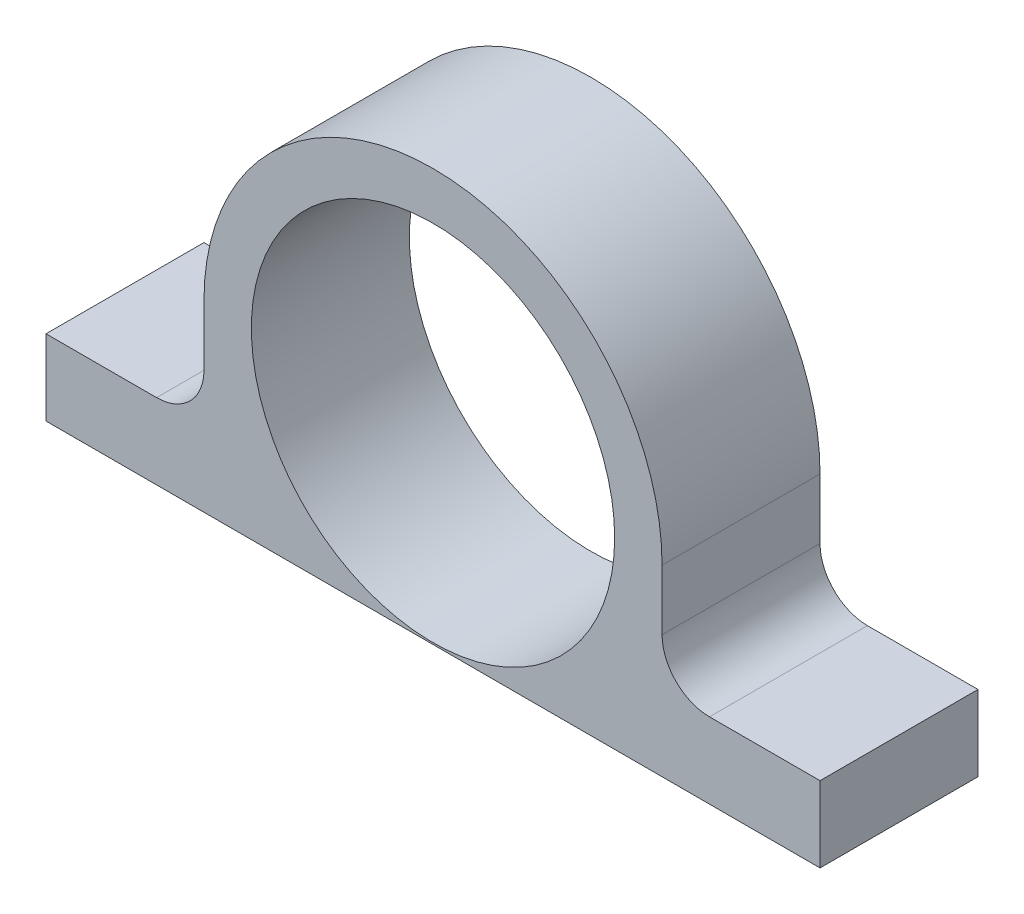
ISO-10303-21;
HEADER;
FILE_DESCRIPTION(('STEP AP214'),'2;1');
FILE_NAME('part.step','',(''),(''),'','','');
FILE_SCHEMA(('AUTOMOTIVE_DESIGN { 1 0 10303 214 1 1 1 1 }'));
ENDSEC;
DATA;
#1=APPLICATION_CONTEXT('core data for automotive mechanical design processes');
#2=APPLICATION_PROTOCOL_DEFINITION('international standard','automotive_design',2000,#1);
#3=PRODUCT_CONTEXT('',#1,'mechanical');
#4=PRODUCT('Part','Part','',(#3));
#5=PRODUCT_RELATED_PRODUCT_CATEGORY('part','',(#4));
#6=PRODUCT_DEFINITION_FORMATION('','',#4);
#7=PRODUCT_DEFINITION_CONTEXT('part definition',#1,'design');
#8=PRODUCT_DEFINITION('design','',#6,#7);
#9=PRODUCT_DEFINITION_SHAPE('','',#8);
#10=(LENGTH_UNIT() NAMED_UNIT(*) SI_UNIT(.MILLI.,.METRE.));
#11=(NAMED_UNIT(*) PLANE_ANGLE_UNIT() SI_UNIT($,.RADIAN.));
#12=(NAMED_UNIT(*) SI_UNIT($,.STERADIAN.) SOLID_ANGLE_UNIT());
#13=UNCERTAINTY_MEASURE_WITH_UNIT(LENGTH_MEASURE(1.E-05),#10,'distance_accuracy_value','');
#14=(GEOMETRIC_REPRESENTATION_CONTEXT(3) GLOBAL_UNCERTAINTY_ASSIGNED_CONTEXT((#13)) GLOBAL_UNIT_ASSIGNED_CONTEXT((#10,
#11,#12)) REPRESENTATION_CONTEXT('',''));
#15=CARTESIAN_POINT('',(0.,0.,0.));
#16=DIRECTION('',(0.,0.,1.));
#17=DIRECTION('',(1.,0.,0.));
#18=AXIS2_PLACEMENT_3D('',#15,#16,#17);
#19=CARTESIAN_POINT('',(0.,78.0732794304208,10.));
#20=DIRECTION('',(0.,1.,0.));
#21=DIRECTION('',(0.,0.,1.));
#22=AXIS2_PLACEMENT_3D('',#19,#20,#21);
#23=PLANE('',#22);
#24=DIRECTION('',(1.,0.,0.));
#25=VECTOR('',#24,1.);
#26=CARTESIAN_POINT('',(0.,78.0732794304208,0.));
#27=LINE('',#26,#25);
#28=CARTESIAN_POINT('',(17.5,78.0732794304208,0.));
#29=VERTEX_POINT('',#28);
#30=CARTESIAN_POINT('',(24.5,78.0732794304208,0.));
#31=VERTEX_POINT('',#30);
#32=EDGE_CURVE('E175',#29,#31,#27,.T.);
#33=ORIENTED_EDGE('',*,*,#32,.F.);
#34=DIRECTION('',(0.,0.,-1.));
#35=VECTOR('',#34,1.);
#36=CARTESIAN_POINT('',(17.5,78.0732794304208,10.));
#37=LINE('',#36,#35);
#38=CARTESIAN_POINT('',(17.5,78.0732794304208,10.));
#39=VERTEX_POINT('',#38);
#40=EDGE_CURVE('E11',#39,#29,#37,.T.);
#41=ORIENTED_EDGE('',*,*,#40,.F.);
#42=DIRECTION('',(1.,0.,0.));
#43=VECTOR('',#42,1.);
#44=CARTESIAN_POINT('',(0.,78.0732794304208,10.));
#45=LINE('',#44,#43);
#46=CARTESIAN_POINT('',(24.5,78.0732794304208,10.));
#47=VERTEX_POINT('',#46);
#48=EDGE_CURVE('E334',#39,#47,#45,.T.);
#49=ORIENTED_EDGE('',*,*,#48,.T.);
#50=DIRECTION('',(0.,0.,-1.));
#51=VECTOR('',#50,1.);
#52=CARTESIAN_POINT('',(24.5,78.0732794304208,10.));
#53=LINE('',#52,#51);
#54=EDGE_CURVE('E59',#47,#31,#53,.T.);
#55=ORIENTED_EDGE('',*,*,#54,.T.);
#56=EDGE_LOOP('',(#33,#41,#49,#55));
#57=FACE_BOUND('',#56,.T.);
#58=ADVANCED_FACE('F41',(#57),#23,.T.);
#59=CARTESIAN_POINT('',(17.5,81.0732794304208,10.));
#60=DIRECTION('',(0.,0.,-1.));
#61=DIRECTION('',(-1.,0.,0.));
#62=AXIS2_PLACEMENT_3D('',#59,#60,#61);
#63=CYLINDRICAL_SURFACE('',#62,3.);
#64=CARTESIAN_POINT('',(17.5,81.0732794304208,0.));
#65=DIRECTION('',(0.,0.,1.));
#66=DIRECTION('',(1.,0.,0.));
#67=AXIS2_PLACEMENT_3D('',#64,#65,#66);
#68=CIRCLE('',#67,3.);
#69=CARTESIAN_POINT('',(14.5,81.0732794304208,0.));
#70=VERTEX_POINT('',#69);
#71=EDGE_CURVE('E166',#29,#70,#68,.F.);
#72=ORIENTED_EDGE('',*,*,#71,.T.);
#73=DIRECTION('',(0.,0.,-1.));
#74=VECTOR('',#73,1.);
#75=CARTESIAN_POINT('',(14.5,81.0732794304208,10.));
#76=LINE('',#75,#74);
#77=CARTESIAN_POINT('',(14.5,81.0732794304208,10.));
#78=VERTEX_POINT('',#77);
#79=EDGE_CURVE('E49',#78,#70,#76,.T.);
#80=ORIENTED_EDGE('',*,*,#79,.F.);
#81=CARTESIAN_POINT('',(17.5,81.0732794304208,10.));
#82=DIRECTION('',(0.,0.,1.));
#83=DIRECTION('',(1.,0.,0.));
#84=AXIS2_PLACEMENT_3D('',#81,#82,#83);
#85=CIRCLE('',#84,3.);
#86=EDGE_CURVE('E332',#39,#78,#85,.F.);
#87=ORIENTED_EDGE('',*,*,#86,.F.);
#88=ORIENTED_EDGE('',*,*,#40,.T.);
#89=EDGE_LOOP('',(#72,#80,#87,#88));
#90=FACE_BOUND('',#89,.T.);
#91=ADVANCED_FACE('F168',(#90),#63,.F.);
#92=CARTESIAN_POINT('',(14.4999999999999,0.,10.));
#93=DIRECTION('',(1.,0.,0.));
#94=DIRECTION('',(0.,1.,0.));
#95=AXIS2_PLACEMENT_3D('',#92,#93,#94);
#96=PLANE('',#95);
#97=DIRECTION('',(0.,-1.,0.));
#98=VECTOR('',#97,1.);
#99=CARTESIAN_POINT('',(14.4999999999999,0.,0.));
#100=LINE('',#99,#98);
#101=CARTESIAN_POINT('',(14.5,84.8872475907308,0.));
#102=VERTEX_POINT('',#101);
#103=EDGE_CURVE('E163',#102,#70,#100,.T.);
#104=ORIENTED_EDGE('',*,*,#103,.F.);
#105=DIRECTION('',(0.,0.,-1.));
#106=VECTOR('',#105,1.);
#107=CARTESIAN_POINT('',(14.5,84.8872475907308,10.));
#108=LINE('',#107,#106);
#109=CARTESIAN_POINT('',(14.5,84.8872475907308,10.));
#110=VERTEX_POINT('',#109);
#111=EDGE_CURVE('E156',#110,#102,#108,.T.);
#112=ORIENTED_EDGE('',*,*,#111,.F.);
#113=DIRECTION('',(0.,-1.,0.));
#114=VECTOR('',#113,1.);
#115=CARTESIAN_POINT('',(14.4999999999999,0.,10.));
#116=LINE('',#115,#114);
#117=EDGE_CURVE('E167',#110,#78,#116,.T.);
#118=ORIENTED_EDGE('',*,*,#117,.T.);
#119=ORIENTED_EDGE('',*,*,#79,.T.);
#120=EDGE_LOOP('',(#104,#112,#118,#119));
#121=FACE_BOUND('',#120,.T.);
#122=ADVANCED_FACE('F165',(#121),#96,.T.);
#123=CARTESIAN_POINT('',(0.,84.8872475907308,10.));
#124=DIRECTION('',(0.,0.,-1.));
#125=DIRECTION('',(-1.,0.,0.));
#126=AXIS2_PLACEMENT_3D('',#123,#124,#125);
#127=CYLINDRICAL_SURFACE('',#126,14.5);
#128=CARTESIAN_POINT('',(0.,84.8872475907308,0.));
#129=DIRECTION('',(0.,0.,1.));
#130=DIRECTION('',(1.,0.,0.));
#131=AXIS2_PLACEMENT_3D('',#128,#129,#130);
#132=CIRCLE('',#131,14.5);
#133=CARTESIAN_POINT('',(-14.5,84.8872475907308,0.));
#134=VERTEX_POINT('',#133);
#135=EDGE_CURVE('E180',#102,#134,#132,.T.);
#136=ORIENTED_EDGE('',*,*,#135,.T.);
#137=DIRECTION('',(0.,0.,-1.));
#138=VECTOR('',#137,1.);
#139=CARTESIAN_POINT('',(-14.5,84.8872475907308,10.));
#140=LINE('',#139,#138);
#141=CARTESIAN_POINT('',(-14.5,84.8872475907308,10.));
#142=VERTEX_POINT('',#141);
#143=EDGE_CURVE('E153',#142,#134,#140,.T.);
#144=ORIENTED_EDGE('',*,*,#143,.F.);
#145=CARTESIAN_POINT('',(0.,84.8872475907308,10.));
#146=DIRECTION('',(0.,0.,1.));
#147=DIRECTION('',(1.,0.,0.));
#148=AXIS2_PLACEMENT_3D('',#145,#146,#147);
#149=CIRCLE('',#148,14.5);
#150=EDGE_CURVE('E328',#110,#142,#149,.T.);
#151=ORIENTED_EDGE('',*,*,#150,.F.);
#152=ORIENTED_EDGE('',*,*,#111,.T.);
#153=EDGE_LOOP('',(#136,#144,#151,#152));
#154=FACE_BOUND('',#153,.T.);
#155=ADVANCED_FACE('F222',(#154),#127,.T.);
#156=CARTESIAN_POINT('',(-14.5,0.,10.));
#157=DIRECTION('',(1.,0.,0.));
#158=DIRECTION('',(0.,1.,0.));
#159=AXIS2_PLACEMENT_3D('',#156,#157,#158);
#160=PLANE('',#159);
#161=DIRECTION('',(0.,-1.,0.));
#162=VECTOR('',#161,1.);
#163=CARTESIAN_POINT('',(-14.5,0.,0.));
#164=LINE('',#163,#162);
#165=CARTESIAN_POINT('',(-14.5,81.0732794304208,0.));
#166=VERTEX_POINT('',#165);
#167=EDGE_CURVE('E178',#134,#166,#164,.T.);
#168=ORIENTED_EDGE('',*,*,#167,.T.);
#169=DIRECTION('',(0.,0.,-1.));
#170=VECTOR('',#169,1.);
#171=CARTESIAN_POINT('',(-14.5,81.0732794304208,10.));
#172=LINE('',#171,#170);
#173=CARTESIAN_POINT('',(-14.5,81.0732794304208,10.));
#174=VERTEX_POINT('',#173);
#175=EDGE_CURVE('E151',#174,#166,#172,.T.);
#176=ORIENTED_EDGE('',*,*,#175,.F.);
#177=DIRECTION('',(0.,-1.,0.));
#178=VECTOR('',#177,1.);
#179=CARTESIAN_POINT('',(-14.5,0.,10.));
#180=LINE('',#179,#178);
#181=EDGE_CURVE('E326',#142,#174,#180,.T.);
#182=ORIENTED_EDGE('',*,*,#181,.F.);
#183=ORIENTED_EDGE('',*,*,#143,.T.);
#184=EDGE_LOOP('',(#168,#176,#182,#183));
#185=FACE_BOUND('',#184,.T.);
#186=ADVANCED_FACE('F221',(#185),#160,.F.);
#187=CARTESIAN_POINT('',(-17.5,81.0732794304208,10.));
#188=DIRECTION('',(0.,0.,-1.));
#189=DIRECTION('',(-1.,0.,0.));
#190=AXIS2_PLACEMENT_3D('',#187,#188,#189);
#191=CYLINDRICAL_SURFACE('',#190,3.);
#192=CARTESIAN_POINT('',(-17.5,81.0732794304208,0.));
#193=DIRECTION('',(0.,0.,1.));
#194=DIRECTION('',(1.,0.,0.));
#195=AXIS2_PLACEMENT_3D('',#192,#193,#194);
#196=CIRCLE('',#195,3.);
#197=CARTESIAN_POINT('',(-17.5,78.0732794304208,0.));
#198=VERTEX_POINT('',#197);
#199=EDGE_CURVE('E183',#198,#166,#196,.T.);
#200=ORIENTED_EDGE('',*,*,#199,.F.);
#201=DIRECTION('',(0.,0.,-1.));
#202=VECTOR('',#201,1.);
#203=CARTESIAN_POINT('',(-17.5,78.0732794304208,10.));
#204=LINE('',#203,#202);
#205=CARTESIAN_POINT('',(-17.5,78.0732794304208,10.));
#206=VERTEX_POINT('',#205);
#207=EDGE_CURVE('E144',#206,#198,#204,.T.);
#208=ORIENTED_EDGE('',*,*,#207,.F.);
#209=CARTESIAN_POINT('',(-17.5,81.0732794304208,10.));
#210=DIRECTION('',(0.,0.,1.));
#211=DIRECTION('',(1.,0.,0.));
#212=AXIS2_PLACEMENT_3D('',#209,#210,#211);
#213=CIRCLE('',#212,3.);
#214=EDGE_CURVE('E322',#206,#174,#213,.T.);
#215=ORIENTED_EDGE('',*,*,#214,.T.);
#216=ORIENTED_EDGE('',*,*,#175,.T.);
#217=EDGE_LOOP('',(#200,#208,#215,#216));
#218=FACE_BOUND('',#217,.T.);
#219=ADVANCED_FACE('F226',(#218),#191,.F.);
#220=CARTESIAN_POINT('',(0.,78.0732794304208,10.));
#221=DIRECTION('',(0.,-1.,0.));
#222=DIRECTION('',(0.,0.,-1.));
#223=AXIS2_PLACEMENT_3D('',#220,#221,#222);
#224=PLANE('',#223);
#225=DIRECTION('',(-1.,0.,0.));
#226=VECTOR('',#225,1.);
#227=CARTESIAN_POINT('',(0.,78.0732794304208,0.));
#228=LINE('',#227,#226);
#229=CARTESIAN_POINT('',(-24.5,78.0732794304208,0.));
#230=VERTEX_POINT('',#229);
#231=EDGE_CURVE('E186',#198,#230,#228,.T.);
#232=ORIENTED_EDGE('',*,*,#231,.T.);
#233=DIRECTION('',(0.,0.,-1.));
#234=VECTOR('',#233,1.);
#235=CARTESIAN_POINT('',(-24.5,78.0732794304208,10.));
#236=LINE('',#235,#234);
#237=CARTESIAN_POINT('',(-24.5,78.0732794304208,10.));
#238=VERTEX_POINT('',#237);
#239=EDGE_CURVE('E141',#238,#230,#236,.T.);
#240=ORIENTED_EDGE('',*,*,#239,.F.);
#241=DIRECTION('',(-1.,0.,0.));
#242=VECTOR('',#241,1.);
#243=CARTESIAN_POINT('',(0.,78.0732794304208,10.));
#244=LINE('',#243,#242);
#245=EDGE_CURVE('E136',#206,#238,#244,.T.);
#246=ORIENTED_EDGE('',*,*,#245,.F.);
#247=ORIENTED_EDGE('',*,*,#207,.T.);
#248=EDGE_LOOP('',(#232,#240,#246,#247));
#249=FACE_BOUND('',#248,.T.);
#250=ADVANCED_FACE('F235',(#249),#224,.F.);
#251=CARTESIAN_POINT('',(-24.5,0.,10.));
#252=DIRECTION('',(1.,0.,0.));
#253=DIRECTION('',(0.,1.,0.));
#254=AXIS2_PLACEMENT_3D('',#251,#252,#253);
#255=PLANE('',#254);
#256=DIRECTION('',(0.,-1.,0.));
#257=VECTOR('',#256,1.);
#258=CARTESIAN_POINT('',(-24.5,0.,0.));
#259=LINE('',#258,#257);
#260=CARTESIAN_POINT('',(-24.5,73.2872475907308,0.));
#261=VERTEX_POINT('',#260);
#262=EDGE_CURVE('E142',#230,#261,#259,.T.);
#263=ORIENTED_EDGE('',*,*,#262,.T.);
#264=DIRECTION('',(0.,0.,-1.));
#265=VECTOR('',#264,1.);
#266=CARTESIAN_POINT('',(-24.5,73.2872475907308,10.));
#267=LINE('',#266,#265);
#268=CARTESIAN_POINT('',(-24.5,73.2872475907308,10.));
#269=VERTEX_POINT('',#268);
#270=EDGE_CURVE('E123',#269,#261,#267,.T.);
#271=ORIENTED_EDGE('',*,*,#270,.F.);
#272=DIRECTION('',(0.,-1.,0.));
#273=VECTOR('',#272,1.);
#274=CARTESIAN_POINT('',(-24.5,0.,10.));
#275=LINE('',#274,#273);
#276=EDGE_CURVE('E129',#238,#269,#275,.T.);
#277=ORIENTED_EDGE('',*,*,#276,.F.);
#278=ORIENTED_EDGE('',*,*,#239,.T.);
#279=EDGE_LOOP('',(#263,#271,#277,#278));
#280=FACE_BOUND('',#279,.T.);
#281=ADVANCED_FACE('F143',(#280),#255,.F.);
#282=CARTESIAN_POINT('',(0.,73.2872475907308,10.));
#283=DIRECTION('',(0.,1.,0.));
#284=DIRECTION('',(0.,0.,1.));
#285=AXIS2_PLACEMENT_3D('',#282,#283,#284);
#286=PLANE('',#285);
#287=DIRECTION('',(1.,0.,0.));
#288=VECTOR('',#287,1.);
#289=CARTESIAN_POINT('',(0.,73.2872475907308,0.));
#290=LINE('',#289,#288);
#291=CARTESIAN_POINT('',(24.5,73.2872475907308,0.));
#292=VERTEX_POINT('',#291);
#293=EDGE_CURVE('E195',#261,#292,#290,.T.);
#294=ORIENTED_EDGE('',*,*,#293,.T.);
#295=DIRECTION('',(0.,0.,-1.));
#296=VECTOR('',#295,1.);
#297=CARTESIAN_POINT('',(24.5,73.2872475907308,10.));
#298=LINE('',#297,#296);
#299=CARTESIAN_POINT('',(24.5,73.2872475907308,10.));
#300=VERTEX_POINT('',#299);
#301=EDGE_CURVE('E89',#300,#292,#298,.T.);
#302=ORIENTED_EDGE('',*,*,#301,.F.);
#303=DIRECTION('',(1.,0.,0.));
#304=VECTOR('',#303,1.);
#305=CARTESIAN_POINT('',(0.,73.2872475907308,10.));
#306=LINE('',#305,#304);
#307=EDGE_CURVE('E117',#269,#300,#306,.T.);
#308=ORIENTED_EDGE('',*,*,#307,.F.);
#309=ORIENTED_EDGE('',*,*,#270,.T.);
#310=EDGE_LOOP('',(#294,#302,#308,#309));
#311=FACE_BOUND('',#310,.T.);
#312=ADVANCED_FACE('F125',(#311),#286,.F.);
#313=CARTESIAN_POINT('',(0.,84.8872475907308,10.));
#314=DIRECTION('',(0.,0.,-1.));
#315=DIRECTION('',(-1.,0.,0.));
#316=AXIS2_PLACEMENT_3D('',#313,#314,#315);
#317=CYLINDRICAL_SURFACE('',#316,11.5);
#318=CARTESIAN_POINT('',(0.,84.8872475907308,10.));
#319=DIRECTION('',(0.,0.,1.));
#320=DIRECTION('',(1.,0.,0.));
#321=AXIS2_PLACEMENT_3D('',#318,#319,#320);
#322=CIRCLE('',#321,11.5);
#323=CARTESIAN_POINT('',(11.5,84.8872475907308,10.));
#324=VERTEX_POINT('',#323);
#325=EDGE_CURVE('E198',#324,#324,#322,.T.);
#326=ORIENTED_EDGE('',*,*,#325,.T.);
#327=EDGE_LOOP('',(#326));
#328=FACE_BOUND('',#327,.T.);
#329=CARTESIAN_POINT('',(0.,84.8872475907308,0.));
#330=DIRECTION('',(0.,0.,1.));
#331=DIRECTION('',(1.,0.,0.));
#332=AXIS2_PLACEMENT_3D('',#329,#330,#331);
#333=CIRCLE('',#332,11.5);
#334=CARTESIAN_POINT('',(11.5,84.8872475907308,0.));
#335=VERTEX_POINT('',#334);
#336=EDGE_CURVE('E200',#335,#335,#333,.T.);
#337=ORIENTED_EDGE('',*,*,#336,.F.);
#338=EDGE_LOOP('',(#337));
#339=FACE_BOUND('',#338,.T.);
#340=ADVANCED_FACE('F43',(#328,#339),#317,.F.);
#341=CARTESIAN_POINT('',(24.5000000000001,0.,10.));
#342=DIRECTION('',(1.,0.,0.));
#343=DIRECTION('',(0.,1.,0.));
#344=AXIS2_PLACEMENT_3D('',#341,#342,#343);
#345=PLANE('',#344);
#346=DIRECTION('',(0.,-1.,0.));
#347=VECTOR('',#346,1.);
#348=CARTESIAN_POINT('',(24.5000000000001,0.,0.));
#349=LINE('',#348,#347);
#350=EDGE_CURVE('E193',#31,#292,#349,.T.);
#351=ORIENTED_EDGE('',*,*,#350,.F.);
#352=ORIENTED_EDGE('',*,*,#54,.F.);
#353=DIRECTION('',(0.,-1.,0.));
#354=VECTOR('',#353,1.);
#355=CARTESIAN_POINT('',(24.5000000000001,0.,10.));
#356=LINE('',#355,#354);
#357=EDGE_CURVE('E126',#47,#300,#356,.T.);
#358=ORIENTED_EDGE('',*,*,#357,.T.);
#359=ORIENTED_EDGE('',*,*,#301,.T.);
#360=EDGE_LOOP('',(#351,#352,#358,#359));
#361=FACE_BOUND('',#360,.T.);
#362=ADVANCED_FACE('F203',(#361),#345,.T.);
#363=CARTESIAN_POINT('',(0.,0.,10.));
#364=DIRECTION('',(0.,0.,1.));
#365=DIRECTION('',(1.,0.,0.));
#366=AXIS2_PLACEMENT_3D('',#363,#364,#365);
#367=PLANE('',#366);
#368=ORIENTED_EDGE('',*,*,#325,.F.);
#369=EDGE_LOOP('',(#368));
#370=FACE_BOUND('',#369,.T.);
#371=ORIENTED_EDGE('',*,*,#48,.F.);
#372=ORIENTED_EDGE('',*,*,#86,.T.);
#373=ORIENTED_EDGE('',*,*,#117,.F.);
#374=ORIENTED_EDGE('',*,*,#150,.T.);
#375=ORIENTED_EDGE('',*,*,#181,.T.);
#376=ORIENTED_EDGE('',*,*,#214,.F.);
#377=ORIENTED_EDGE('',*,*,#245,.T.);
#378=ORIENTED_EDGE('',*,*,#276,.T.);
#379=ORIENTED_EDGE('',*,*,#307,.T.);
#380=ORIENTED_EDGE('',*,*,#357,.F.);
#381=EDGE_LOOP('',(#371,#372,#373,#374,#375,#376,#377,#378,#379,#380));
#382=FACE_BOUND('',#381,.T.);
#383=ADVANCED_FACE('F131',(#370,#382),#367,.T.);
#384=CARTESIAN_POINT('',(0.,0.,0.));
#385=DIRECTION('',(0.,0.,1.));
#386=DIRECTION('',(1.,0.,0.));
#387=AXIS2_PLACEMENT_3D('',#384,#385,#386);
#388=PLANE('',#387);
#389=ORIENTED_EDGE('',*,*,#336,.T.);
#390=EDGE_LOOP('',(#389));
#391=FACE_BOUND('',#390,.T.);
#392=ORIENTED_EDGE('',*,*,#32,.T.);
#393=ORIENTED_EDGE('',*,*,#350,.T.);
#394=ORIENTED_EDGE('',*,*,#293,.F.);
#395=ORIENTED_EDGE('',*,*,#262,.F.);
#396=ORIENTED_EDGE('',*,*,#231,.F.);
#397=ORIENTED_EDGE('',*,*,#199,.T.);
#398=ORIENTED_EDGE('',*,*,#167,.F.);
#399=ORIENTED_EDGE('',*,*,#135,.F.);
#400=ORIENTED_EDGE('',*,*,#103,.T.);
#401=ORIENTED_EDGE('',*,*,#71,.F.);
#402=EDGE_LOOP('',(#392,#393,#394,#395,#396,#397,#398,#399,#400,#401));
#403=FACE_BOUND('',#402,.T.);
#404=ADVANCED_FACE('F172',(#391,#403),#388,.F.);
#405=CLOSED_SHELL('',(#58,#91,#122,#155,#186,#219,#250,#281,#312,#340,#362,#383,#404));
#406=MANIFOLD_SOLID_BREP('B2',#405);
#407=ADVANCED_BREP_SHAPE_REPRESENTATION('',(#18,#406),#14);
#408=SHAPE_DEFINITION_REPRESENTATION(#9,#407);
ENDSEC;
END-ISO-10303-21;
